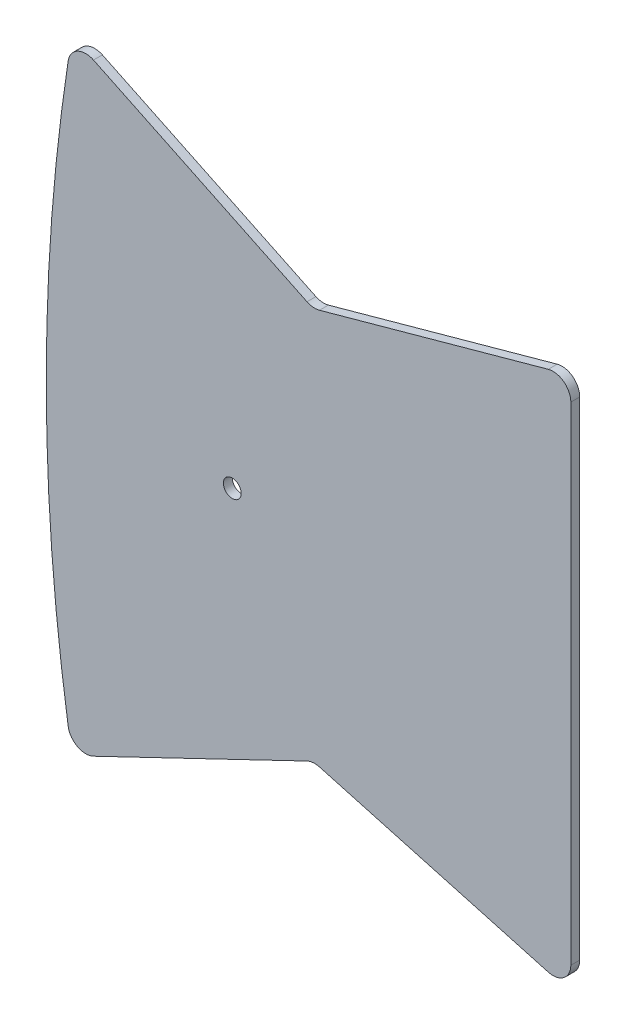
ISO-10303-21;
HEADER;
FILE_DESCRIPTION(('STEP AP214'),'2;1');
FILE_NAME('part.step','',(''),(''),'','','');
FILE_SCHEMA(('AUTOMOTIVE_DESIGN { 1 0 10303 214 1 1 1 1 }'));
ENDSEC;
DATA;
#1=APPLICATION_CONTEXT('core data for automotive mechanical design processes');
#2=APPLICATION_PROTOCOL_DEFINITION('international standard','automotive_design',2000,#1);
#3=PRODUCT_CONTEXT('',#1,'mechanical');
#4=PRODUCT('Part','Part','',(#3));
#5=PRODUCT_RELATED_PRODUCT_CATEGORY('part','',(#4));
#6=PRODUCT_DEFINITION_FORMATION('','',#4);
#7=PRODUCT_DEFINITION_CONTEXT('part definition',#1,'design');
#8=PRODUCT_DEFINITION('design','',#6,#7);
#9=PRODUCT_DEFINITION_SHAPE('','',#8);
#10=(LENGTH_UNIT() NAMED_UNIT(*) SI_UNIT(.MILLI.,.METRE.));
#11=(NAMED_UNIT(*) PLANE_ANGLE_UNIT() SI_UNIT($,.RADIAN.));
#12=(NAMED_UNIT(*) SI_UNIT($,.STERADIAN.) SOLID_ANGLE_UNIT());
#13=UNCERTAINTY_MEASURE_WITH_UNIT(LENGTH_MEASURE(1.E-05),#10,'distance_accuracy_value','');
#14=(GEOMETRIC_REPRESENTATION_CONTEXT(3) GLOBAL_UNCERTAINTY_ASSIGNED_CONTEXT((#13)) GLOBAL_UNIT_ASSIGNED_CONTEXT((#10,
#11,#12)) REPRESENTATION_CONTEXT('',''));
#15=CARTESIAN_POINT('',(0.,0.,0.));
#16=DIRECTION('',(0.,0.,1.));
#17=DIRECTION('',(1.,0.,0.));
#18=AXIS2_PLACEMENT_3D('',#15,#16,#17);
#19=CARTESIAN_POINT('',(492.501079273337,0.,3.175));
#20=DIRECTION('',(0.,0.,1.));
#21=DIRECTION('',(1.,0.,0.));
#22=AXIS2_PLACEMENT_3D('',#19,#20,#21);
#23=PLANE('',#22);
#24=DIRECTION('',(0.,1.,0.));
#25=VECTOR('',#24,1.);
#26=CARTESIAN_POINT('',(0.,95.25,3.175));
#27=LINE('',#26,#25);
#28=CARTESIAN_POINT('',(0.,-86.906297938991,3.175));
#29=VERTEX_POINT('',#28);
#30=CARTESIAN_POINT('',(0.,86.906297938991,3.175));
#31=VERTEX_POINT('',#30);
#32=EDGE_CURVE('E274',#29,#31,#27,.T.);
#33=ORIENTED_EDGE('',*,*,#32,.T.);
#34=CARTESIAN_POINT('',(-6.35000000000001,86.906297938991,3.175));
#35=DIRECTION('',(0.,0.,1.));
#36=DIRECTION('',(1.,0.,0.));
#37=AXIS2_PLACEMENT_3D('',#34,#35,#36);
#38=CIRCLE('',#37,6.35);
#39=CARTESIAN_POINT('',(-8.04203762873565,93.0267152991832,3.175));
#40=VERTEX_POINT('',#39);
#41=EDGE_CURVE('E232',#31,#40,#38,.T.);
#42=ORIENTED_EDGE('',*,*,#41,.T.);
#43=DIRECTION('',(-0.963845253573582,-0.266462618698528,0.));
#44=VECTOR('',#43,1.);
#45=CARTESIAN_POINT('',(-91.8765625,69.85,3.175));
#46=LINE('',#45,#44);
#47=CARTESIAN_POINT('',(-89.5814059899279,70.4845141107759,3.175));
#48=VERTEX_POINT('',#47);
#49=EDGE_CURVE('E279',#40,#48,#46,.T.);
#50=ORIENTED_EDGE('',*,*,#49,.T.);
#51=CARTESIAN_POINT('',(-91.2734436186635,76.6049314709681,3.175));
#52=DIRECTION('',(0.,0.,1.));
#53=DIRECTION('',(1.,0.,0.));
#54=AXIS2_PLACEMENT_3D('',#51,#52,#53);
#55=CIRCLE('',#54,6.35);
#56=CARTESIAN_POINT('',(-94.023004765359,70.8810854300108,3.175));
#57=VERTEX_POINT('',#56);
#58=EDGE_CURVE('E164',#48,#57,#55,.F.);
#59=ORIENTED_EDGE('',*,*,#58,.T.);
#60=DIRECTION('',(-0.901393077316115,0.433001755385108,0.));
#61=VECTOR('',#60,1.);
#62=CARTESIAN_POINT('',(-177.8,111.125,3.175));
#63=LINE('',#62,#61);
#64=CARTESIAN_POINT('',(-170.120144906821,107.435831733531,3.175));
#65=VERTEX_POINT('',#64);
#66=EDGE_CURVE('E174',#57,#65,#63,.T.);
#67=ORIENTED_EDGE('',*,*,#66,.T.);
#68=CARTESIAN_POINT('',(-172.869706053517,101.711985692574,3.175));
#69=DIRECTION('',(0.,0.,1.));
#70=DIRECTION('',(1.,0.,0.));
#71=AXIS2_PLACEMENT_3D('',#68,#69,#70);
#72=CIRCLE('',#71,6.35);
#73=CARTESIAN_POINT('',(-179.146788933959,102.671532727409,3.175));
#74=VERTEX_POINT('',#73);
#75=EDGE_CURVE('E223',#65,#74,#72,.T.);
#76=ORIENTED_EDGE('',*,*,#75,.T.);
#77=CARTESIAN_POINT('',(492.501079273337,0.,3.175));
#78=DIRECTION('',(0.,0.,1.));
#79=DIRECTION('',(1.,0.,0.));
#80=AXIS2_PLACEMENT_3D('',#77,#78,#79);
#81=CIRCLE('',#80,679.45);
#82=CARTESIAN_POINT('',(-179.146788933959,-102.671532727409,3.175));
#83=VERTEX_POINT('',#82);
#84=EDGE_CURVE('E184',#74,#83,#81,.T.);
#85=ORIENTED_EDGE('',*,*,#84,.T.);
#86=CARTESIAN_POINT('',(-172.869706053517,-101.711985692574,3.175));
#87=DIRECTION('',(0.,0.,1.));
#88=DIRECTION('',(1.,0.,0.));
#89=AXIS2_PLACEMENT_3D('',#86,#87,#88);
#90=CIRCLE('',#89,6.35);
#91=CARTESIAN_POINT('',(-170.120144906821,-107.435831733531,3.175));
#92=VERTEX_POINT('',#91);
#93=EDGE_CURVE('E226',#83,#92,#90,.T.);
#94=ORIENTED_EDGE('',*,*,#93,.T.);
#95=DIRECTION('',(0.901393077316115,0.433001755385108,0.));
#96=VECTOR('',#95,1.);
#97=CARTESIAN_POINT('',(-91.8765625,-69.85,3.175));
#98=LINE('',#97,#96);
#99=CARTESIAN_POINT('',(-94.023004765359,-70.8810854300108,3.175));
#100=VERTEX_POINT('',#99);
#101=EDGE_CURVE('E191',#92,#100,#98,.T.);
#102=ORIENTED_EDGE('',*,*,#101,.T.);
#103=CARTESIAN_POINT('',(-91.2734436186636,-76.6049314709681,3.175));
#104=DIRECTION('',(0.,0.,1.));
#105=DIRECTION('',(1.,0.,0.));
#106=AXIS2_PLACEMENT_3D('',#103,#104,#105);
#107=CIRCLE('',#106,6.35);
#108=CARTESIAN_POINT('',(-89.5814059899279,-70.4845141107759,3.175));
#109=VERTEX_POINT('',#108);
#110=EDGE_CURVE('E11',#100,#109,#107,.F.);
#111=ORIENTED_EDGE('',*,*,#110,.T.);
#112=DIRECTION('',(0.963845253573582,-0.266462618698528,0.));
#113=VECTOR('',#112,1.);
#114=CARTESIAN_POINT('',(0.,-95.25,3.175));
#115=LINE('',#114,#113);
#116=CARTESIAN_POINT('',(-8.04203762873566,-93.0267152991832,3.175));
#117=VERTEX_POINT('',#116);
#118=EDGE_CURVE('E272',#109,#117,#115,.T.);
#119=ORIENTED_EDGE('',*,*,#118,.T.);
#120=CARTESIAN_POINT('',(-6.35,-86.906297938991,3.175));
#121=DIRECTION('',(0.,0.,1.));
#122=DIRECTION('',(1.,0.,0.));
#123=AXIS2_PLACEMENT_3D('',#120,#121,#122);
#124=CIRCLE('',#123,6.35);
#125=EDGE_CURVE('E229',#117,#29,#124,.T.);
#126=ORIENTED_EDGE('',*,*,#125,.T.);
#127=EDGE_LOOP('',(#33,#42,#50,#59,#67,#76,#85,#94,#102,#111,#119,#126));
#128=FACE_BOUND('',#127,.T.);
#129=CARTESIAN_POINT('',(-120.65,0.,3.175));
#130=DIRECTION('',(0.,0.,1.));
#131=DIRECTION('',(1.,0.,0.));
#132=AXIS2_PLACEMENT_3D('',#129,#130,#131);
#133=CIRCLE('',#132,3.175);
#134=CARTESIAN_POINT('',(-117.475,0.,3.175));
#135=VERTEX_POINT('',#134);
#136=EDGE_CURVE('E291',#135,#135,#133,.T.);
#137=ORIENTED_EDGE('',*,*,#136,.F.);
#138=EDGE_LOOP('',(#137));
#139=FACE_BOUND('',#138,.T.);
#140=ADVANCED_FACE('F39',(#128,#139),#23,.T.);
#141=CARTESIAN_POINT('',(492.501079273337,0.,0.));
#142=DIRECTION('',(0.,0.,1.));
#143=DIRECTION('',(1.,0.,0.));
#144=AXIS2_PLACEMENT_3D('',#141,#142,#143);
#145=PLANE('',#144);
#146=DIRECTION('',(-0.963845253573582,-0.266462618698528,0.));
#147=VECTOR('',#146,1.);
#148=CARTESIAN_POINT('',(-91.8765625,69.85,0.));
#149=LINE('',#148,#147);
#150=CARTESIAN_POINT('',(-8.04203762873565,93.0267152991832,0.));
#151=VERTEX_POINT('',#150);
#152=CARTESIAN_POINT('',(-89.5814059899279,70.4845141107759,0.));
#153=VERTEX_POINT('',#152);
#154=EDGE_CURVE('E185',#151,#153,#149,.T.);
#155=ORIENTED_EDGE('',*,*,#154,.F.);
#156=CARTESIAN_POINT('',(-6.35000000000001,86.906297938991,0.));
#157=DIRECTION('',(0.,0.,1.));
#158=DIRECTION('',(1.,0.,0.));
#159=AXIS2_PLACEMENT_3D('',#156,#157,#158);
#160=CIRCLE('',#159,6.35);
#161=CARTESIAN_POINT('',(0.,86.906297938991,0.));
#162=VERTEX_POINT('',#161);
#163=EDGE_CURVE('E213',#151,#162,#160,.F.);
#164=ORIENTED_EDGE('',*,*,#163,.T.);
#165=DIRECTION('',(0.,1.,0.));
#166=VECTOR('',#165,1.);
#167=CARTESIAN_POINT('',(0.,95.25,0.));
#168=LINE('',#167,#166);
#169=CARTESIAN_POINT('',(0.,-86.906297938991,0.));
#170=VERTEX_POINT('',#169);
#171=EDGE_CURVE('E194',#170,#162,#168,.T.);
#172=ORIENTED_EDGE('',*,*,#171,.F.);
#173=CARTESIAN_POINT('',(-6.35,-86.906297938991,0.));
#174=DIRECTION('',(0.,0.,1.));
#175=DIRECTION('',(1.,0.,0.));
#176=AXIS2_PLACEMENT_3D('',#173,#174,#175);
#177=CIRCLE('',#176,6.35);
#178=CARTESIAN_POINT('',(-8.04203762873566,-93.0267152991832,0.));
#179=VERTEX_POINT('',#178);
#180=EDGE_CURVE('E210',#170,#179,#177,.F.);
#181=ORIENTED_EDGE('',*,*,#180,.T.);
#182=DIRECTION('',(0.963845253573582,-0.266462618698528,0.));
#183=VECTOR('',#182,1.);
#184=CARTESIAN_POINT('',(0.,-95.25,0.));
#185=LINE('',#184,#183);
#186=CARTESIAN_POINT('',(-89.5814059899279,-70.4845141107759,0.));
#187=VERTEX_POINT('',#186);
#188=EDGE_CURVE('E260',#187,#179,#185,.T.);
#189=ORIENTED_EDGE('',*,*,#188,.F.);
#190=CARTESIAN_POINT('',(-91.2734436186636,-76.6049314709681,0.));
#191=DIRECTION('',(0.,0.,1.));
#192=DIRECTION('',(1.,0.,0.));
#193=AXIS2_PLACEMENT_3D('',#190,#191,#192);
#194=CIRCLE('',#193,6.35);
#195=CARTESIAN_POINT('',(-94.023004765359,-70.8810854300108,0.));
#196=VERTEX_POINT('',#195);
#197=EDGE_CURVE('E48',#187,#196,#194,.T.);
#198=ORIENTED_EDGE('',*,*,#197,.T.);
#199=DIRECTION('',(0.901393077316115,0.433001755385108,0.));
#200=VECTOR('',#199,1.);
#201=CARTESIAN_POINT('',(-91.8765625,-69.85,0.));
#202=LINE('',#201,#200);
#203=CARTESIAN_POINT('',(-170.120144906821,-107.435831733531,0.));
#204=VERTEX_POINT('',#203);
#205=EDGE_CURVE('E259',#204,#196,#202,.T.);
#206=ORIENTED_EDGE('',*,*,#205,.F.);
#207=CARTESIAN_POINT('',(-172.869706053517,-101.711985692574,0.));
#208=DIRECTION('',(0.,0.,1.));
#209=DIRECTION('',(1.,0.,0.));
#210=AXIS2_PLACEMENT_3D('',#207,#208,#209);
#211=CIRCLE('',#210,6.35);
#212=CARTESIAN_POINT('',(-179.146788933959,-102.671532727409,0.));
#213=VERTEX_POINT('',#212);
#214=EDGE_CURVE('E207',#204,#213,#211,.F.);
#215=ORIENTED_EDGE('',*,*,#214,.T.);
#216=CARTESIAN_POINT('',(492.501079273337,0.,0.));
#217=DIRECTION('',(0.,0.,1.));
#218=DIRECTION('',(1.,0.,0.));
#219=AXIS2_PLACEMENT_3D('',#216,#217,#218);
#220=CIRCLE('',#219,679.45);
#221=CARTESIAN_POINT('',(-179.146788933959,102.671532727409,0.));
#222=VERTEX_POINT('',#221);
#223=EDGE_CURVE('E268',#222,#213,#220,.T.);
#224=ORIENTED_EDGE('',*,*,#223,.F.);
#225=CARTESIAN_POINT('',(-172.869706053517,101.711985692574,0.));
#226=DIRECTION('',(0.,0.,1.));
#227=DIRECTION('',(1.,0.,0.));
#228=AXIS2_PLACEMENT_3D('',#225,#226,#227);
#229=CIRCLE('',#228,6.35);
#230=CARTESIAN_POINT('',(-170.120144906821,107.435831733531,0.));
#231=VERTEX_POINT('',#230);
#232=EDGE_CURVE('E182',#222,#231,#229,.F.);
#233=ORIENTED_EDGE('',*,*,#232,.T.);
#234=DIRECTION('',(-0.901393077316115,0.433001755385108,0.));
#235=VECTOR('',#234,1.);
#236=CARTESIAN_POINT('',(-177.8,111.125,0.));
#237=LINE('',#236,#235);
#238=CARTESIAN_POINT('',(-94.023004765359,70.8810854300108,0.));
#239=VERTEX_POINT('',#238);
#240=EDGE_CURVE('E171',#239,#231,#237,.T.);
#241=ORIENTED_EDGE('',*,*,#240,.F.);
#242=CARTESIAN_POINT('',(-91.2734436186635,76.6049314709681,0.));
#243=DIRECTION('',(0.,0.,1.));
#244=DIRECTION('',(1.,0.,0.));
#245=AXIS2_PLACEMENT_3D('',#242,#243,#244);
#246=CIRCLE('',#245,6.35);
#247=EDGE_CURVE('E153',#239,#153,#246,.T.);
#248=ORIENTED_EDGE('',*,*,#247,.T.);
#249=EDGE_LOOP('',(#155,#164,#172,#181,#189,#198,#206,#215,#224,#233,#241,#248));
#250=FACE_BOUND('',#249,.T.);
#251=CARTESIAN_POINT('',(-120.65,0.,0.));
#252=DIRECTION('',(0.,0.,1.));
#253=DIRECTION('',(1.,0.,0.));
#254=AXIS2_PLACEMENT_3D('',#251,#252,#253);
#255=CIRCLE('',#254,3.175);
#256=CARTESIAN_POINT('',(-117.475,0.,0.));
#257=VERTEX_POINT('',#256);
#258=EDGE_CURVE('E337',#257,#257,#255,.T.);
#259=ORIENTED_EDGE('',*,*,#258,.T.);
#260=EDGE_LOOP('',(#259));
#261=FACE_BOUND('',#260,.T.);
#262=ADVANCED_FACE('F179',(#250,#261),#145,.F.);
#263=CARTESIAN_POINT('',(492.501079273337,0.,3.175));
#264=DIRECTION('',(0.,0.,-1.));
#265=DIRECTION('',(-1.,0.,0.));
#266=AXIS2_PLACEMENT_3D('',#263,#264,#265);
#267=CYLINDRICAL_SURFACE('',#266,679.45);
#268=ORIENTED_EDGE('',*,*,#223,.T.);
#269=DIRECTION('',(0.,0.,-1.));
#270=VECTOR('',#269,1.);
#271=CARTESIAN_POINT('',(-179.146788933959,-102.671532727409,3.175));
#272=LINE('',#271,#270);
#273=EDGE_CURVE('E165',#213,#83,#272,.F.);
#274=ORIENTED_EDGE('',*,*,#273,.T.);
#275=ORIENTED_EDGE('',*,*,#84,.F.);
#276=DIRECTION('',(0.,0.,-1.));
#277=VECTOR('',#276,1.);
#278=CARTESIAN_POINT('',(-179.146788933959,102.671532727409,3.175));
#279=LINE('',#278,#277);
#280=EDGE_CURVE('E247',#74,#222,#279,.T.);
#281=ORIENTED_EDGE('',*,*,#280,.T.);
#282=EDGE_LOOP('',(#268,#274,#275,#281));
#283=FACE_BOUND('',#282,.T.);
#284=ADVANCED_FACE('F323',(#283),#267,.T.);
#285=CARTESIAN_POINT('',(-91.8765625,-69.85,3.175));
#286=DIRECTION('',(-0.433001755385108,0.901393077316115,0.));
#287=DIRECTION('',(-0.901393077316115,-0.433001755385108,0.));
#288=AXIS2_PLACEMENT_3D('',#285,#286,#287);
#289=PLANE('',#288);
#290=ORIENTED_EDGE('',*,*,#205,.T.);
#291=DIRECTION('',(0.,0.,-1.));
#292=VECTOR('',#291,1.);
#293=CARTESIAN_POINT('',(-94.023004765359,-70.8810854300108,3.175));
#294=LINE('',#293,#292);
#295=EDGE_CURVE('E245',#196,#100,#294,.F.);
#296=ORIENTED_EDGE('',*,*,#295,.T.);
#297=ORIENTED_EDGE('',*,*,#101,.F.);
#298=DIRECTION('',(0.,0.,-1.));
#299=VECTOR('',#298,1.);
#300=CARTESIAN_POINT('',(-170.120144906821,-107.435831733531,3.175));
#301=LINE('',#300,#299);
#302=EDGE_CURVE('E241',#92,#204,#301,.T.);
#303=ORIENTED_EDGE('',*,*,#302,.T.);
#304=EDGE_LOOP('',(#290,#296,#297,#303));
#305=FACE_BOUND('',#304,.T.);
#306=ADVANCED_FACE('F265',(#305),#289,.F.);
#307=CARTESIAN_POINT('',(0.,-95.25,3.175));
#308=DIRECTION('',(0.266462618698528,0.963845253573582,0.));
#309=DIRECTION('',(-0.963845253573582,0.266462618698528,0.));
#310=AXIS2_PLACEMENT_3D('',#307,#308,#309);
#311=PLANE('',#310);
#312=ORIENTED_EDGE('',*,*,#188,.T.);
#313=DIRECTION('',(0.,0.,-1.));
#314=VECTOR('',#313,1.);
#315=CARTESIAN_POINT('',(-8.04203762873566,-93.0267152991832,3.175));
#316=LINE('',#315,#314);
#317=EDGE_CURVE('E58',#179,#117,#316,.F.);
#318=ORIENTED_EDGE('',*,*,#317,.T.);
#319=ORIENTED_EDGE('',*,*,#118,.F.);
#320=DIRECTION('',(0.,0.,-1.));
#321=VECTOR('',#320,1.);
#322=CARTESIAN_POINT('',(-89.5814059899279,-70.4845141107759,0.));
#323=LINE('',#322,#321);
#324=EDGE_CURVE('E235',#109,#187,#323,.T.);
#325=ORIENTED_EDGE('',*,*,#324,.T.);
#326=EDGE_LOOP('',(#312,#318,#319,#325));
#327=FACE_BOUND('',#326,.T.);
#328=ADVANCED_FACE('F271',(#327),#311,.F.);
#329=CARTESIAN_POINT('',(0.,95.25,3.175));
#330=DIRECTION('',(-1.,0.,0.));
#331=DIRECTION('',(0.,-1.,0.));
#332=AXIS2_PLACEMENT_3D('',#329,#330,#331);
#333=PLANE('',#332);
#334=ORIENTED_EDGE('',*,*,#171,.T.);
#335=DIRECTION('',(0.,0.,-1.));
#336=VECTOR('',#335,1.);
#337=CARTESIAN_POINT('',(0.,86.906297938991,3.175));
#338=LINE('',#337,#336);
#339=EDGE_CURVE('E220',#162,#31,#338,.F.);
#340=ORIENTED_EDGE('',*,*,#339,.T.);
#341=ORIENTED_EDGE('',*,*,#32,.F.);
#342=DIRECTION('',(0.,0.,-1.));
#343=VECTOR('',#342,1.);
#344=CARTESIAN_POINT('',(0.,-86.906297938991,3.175));
#345=LINE('',#344,#343);
#346=EDGE_CURVE('E216',#29,#170,#345,.T.);
#347=ORIENTED_EDGE('',*,*,#346,.T.);
#348=EDGE_LOOP('',(#334,#340,#341,#347));
#349=FACE_BOUND('',#348,.T.);
#350=ADVANCED_FACE('F298',(#349),#333,.F.);
#351=CARTESIAN_POINT('',(-91.8765625,69.85,3.175));
#352=DIRECTION('',(0.266462618698528,-0.963845253573582,0.));
#353=DIRECTION('',(0.963845253573582,0.266462618698528,0.));
#354=AXIS2_PLACEMENT_3D('',#351,#352,#353);
#355=PLANE('',#354);
#356=ORIENTED_EDGE('',*,*,#154,.T.);
#357=DIRECTION('',(0.,0.,-1.));
#358=VECTOR('',#357,1.);
#359=CARTESIAN_POINT('',(-89.5814059899279,70.4845141107759,3.175));
#360=LINE('',#359,#358);
#361=EDGE_CURVE('E158',#153,#48,#360,.F.);
#362=ORIENTED_EDGE('',*,*,#361,.T.);
#363=ORIENTED_EDGE('',*,*,#49,.F.);
#364=DIRECTION('',(0.,0.,-1.));
#365=VECTOR('',#364,1.);
#366=CARTESIAN_POINT('',(-8.04203762873565,93.0267152991832,3.175));
#367=LINE('',#366,#365);
#368=EDGE_CURVE('E176',#40,#151,#367,.T.);
#369=ORIENTED_EDGE('',*,*,#368,.T.);
#370=EDGE_LOOP('',(#356,#362,#363,#369));
#371=FACE_BOUND('',#370,.T.);
#372=ADVANCED_FACE('F308',(#371),#355,.F.);
#373=CARTESIAN_POINT('',(-177.8,111.125,3.175));
#374=DIRECTION('',(-0.433001755385108,-0.901393077316115,0.));
#375=DIRECTION('',(0.901393077316115,-0.433001755385108,0.));
#376=AXIS2_PLACEMENT_3D('',#373,#374,#375);
#377=PLANE('',#376);
#378=ORIENTED_EDGE('',*,*,#66,.F.);
#379=DIRECTION('',(0.,0.,-1.));
#380=VECTOR('',#379,1.);
#381=CARTESIAN_POINT('',(-94.023004765359,70.8810854300108,0.));
#382=LINE('',#381,#380);
#383=EDGE_CURVE('E157',#57,#239,#382,.T.);
#384=ORIENTED_EDGE('',*,*,#383,.T.);
#385=ORIENTED_EDGE('',*,*,#240,.T.);
#386=DIRECTION('',(0.,0.,-1.));
#387=VECTOR('',#386,1.);
#388=CARTESIAN_POINT('',(-170.120144906821,107.435831733531,3.175));
#389=LINE('',#388,#387);
#390=EDGE_CURVE('E177',#231,#65,#389,.F.);
#391=ORIENTED_EDGE('',*,*,#390,.T.);
#392=EDGE_LOOP('',(#378,#384,#385,#391));
#393=FACE_BOUND('',#392,.T.);
#394=ADVANCED_FACE('F170',(#393),#377,.F.);
#395=CARTESIAN_POINT('',(-120.65,0.,3.175));
#396=DIRECTION('',(0.,0.,-1.));
#397=DIRECTION('',(-1.,0.,0.));
#398=AXIS2_PLACEMENT_3D('',#395,#396,#397);
#399=CYLINDRICAL_SURFACE('',#398,3.175);
#400=ORIENTED_EDGE('',*,*,#136,.T.);
#401=EDGE_LOOP('',(#400));
#402=FACE_BOUND('',#401,.T.);
#403=ORIENTED_EDGE('',*,*,#258,.F.);
#404=EDGE_LOOP('',(#403));
#405=FACE_BOUND('',#404,.T.);
#406=ADVANCED_FACE('F315',(#402,#405),#399,.F.);
#407=CARTESIAN_POINT('',(-91.2734436186635,76.6049314709681,3.175));
#408=DIRECTION('',(0.,0.,1.));
#409=DIRECTION('',(1.,0.,0.));
#410=AXIS2_PLACEMENT_3D('',#407,#408,#409);
#411=CYLINDRICAL_SURFACE('',#410,6.35);
#412=ORIENTED_EDGE('',*,*,#58,.F.);
#413=ORIENTED_EDGE('',*,*,#361,.F.);
#414=ORIENTED_EDGE('',*,*,#247,.F.);
#415=ORIENTED_EDGE('',*,*,#383,.F.);
#416=EDGE_LOOP('',(#412,#413,#414,#415));
#417=FACE_BOUND('',#416,.T.);
#418=ADVANCED_FACE('F156',(#417),#411,.F.);
#419=CARTESIAN_POINT('',(-6.35000000000001,86.906297938991,3.175));
#420=DIRECTION('',(0.,0.,-1.));
#421=DIRECTION('',(-1.,0.,0.));
#422=AXIS2_PLACEMENT_3D('',#419,#420,#421);
#423=CYLINDRICAL_SURFACE('',#422,6.35);
#424=ORIENTED_EDGE('',*,*,#41,.F.);
#425=ORIENTED_EDGE('',*,*,#339,.F.);
#426=ORIENTED_EDGE('',*,*,#163,.F.);
#427=ORIENTED_EDGE('',*,*,#368,.F.);
#428=EDGE_LOOP('',(#424,#425,#426,#427));
#429=FACE_BOUND('',#428,.T.);
#430=ADVANCED_FACE('F303',(#429),#423,.T.);
#431=CARTESIAN_POINT('',(-6.35,-86.906297938991,3.175));
#432=DIRECTION('',(0.,0.,-1.));
#433=DIRECTION('',(-1.,0.,0.));
#434=AXIS2_PLACEMENT_3D('',#431,#432,#433);
#435=CYLINDRICAL_SURFACE('',#434,6.35);
#436=ORIENTED_EDGE('',*,*,#125,.F.);
#437=ORIENTED_EDGE('',*,*,#317,.F.);
#438=ORIENTED_EDGE('',*,*,#180,.F.);
#439=ORIENTED_EDGE('',*,*,#346,.F.);
#440=EDGE_LOOP('',(#436,#437,#438,#439));
#441=FACE_BOUND('',#440,.T.);
#442=ADVANCED_FACE('F345',(#441),#435,.T.);
#443=CARTESIAN_POINT('',(-91.2734436186636,-76.6049314709681,3.175));
#444=DIRECTION('',(0.,0.,1.));
#445=DIRECTION('',(1.,0.,0.));
#446=AXIS2_PLACEMENT_3D('',#443,#444,#445);
#447=CYLINDRICAL_SURFACE('',#446,6.35);
#448=ORIENTED_EDGE('',*,*,#110,.F.);
#449=ORIENTED_EDGE('',*,*,#295,.F.);
#450=ORIENTED_EDGE('',*,*,#197,.F.);
#451=ORIENTED_EDGE('',*,*,#324,.F.);
#452=EDGE_LOOP('',(#448,#449,#450,#451));
#453=FACE_BOUND('',#452,.T.);
#454=ADVANCED_FACE('F270',(#453),#447,.F.);
#455=CARTESIAN_POINT('',(-172.869706053517,-101.711985692574,3.175));
#456=DIRECTION('',(0.,0.,-1.));
#457=DIRECTION('',(-1.,0.,0.));
#458=AXIS2_PLACEMENT_3D('',#455,#456,#457);
#459=CYLINDRICAL_SURFACE('',#458,6.35);
#460=ORIENTED_EDGE('',*,*,#93,.F.);
#461=ORIENTED_EDGE('',*,*,#273,.F.);
#462=ORIENTED_EDGE('',*,*,#214,.F.);
#463=ORIENTED_EDGE('',*,*,#302,.F.);
#464=EDGE_LOOP('',(#460,#461,#462,#463));
#465=FACE_BOUND('',#464,.T.);
#466=ADVANCED_FACE('F354',(#465),#459,.T.);
#467=CARTESIAN_POINT('',(-172.869706053517,101.711985692574,3.175));
#468=DIRECTION('',(0.,0.,-1.));
#469=DIRECTION('',(-1.,0.,0.));
#470=AXIS2_PLACEMENT_3D('',#467,#468,#469);
#471=CYLINDRICAL_SURFACE('',#470,6.35);
#472=ORIENTED_EDGE('',*,*,#75,.F.);
#473=ORIENTED_EDGE('',*,*,#390,.F.);
#474=ORIENTED_EDGE('',*,*,#232,.F.);
#475=ORIENTED_EDGE('',*,*,#280,.F.);
#476=EDGE_LOOP('',(#472,#473,#474,#475));
#477=FACE_BOUND('',#476,.T.);
#478=ADVANCED_FACE('F41',(#477),#471,.T.);
#479=CLOSED_SHELL('',(#140,#262,#284,#306,#328,#350,#372,#394,#406,#418,#430,#442,#454,#466,#478));
#480=MANIFOLD_SOLID_BREP('B2',#479);
#481=ADVANCED_BREP_SHAPE_REPRESENTATION('',(#18,#480),#14);
#482=SHAPE_DEFINITION_REPRESENTATION(#9,#481);
ENDSEC;
END-ISO-10303-21;
